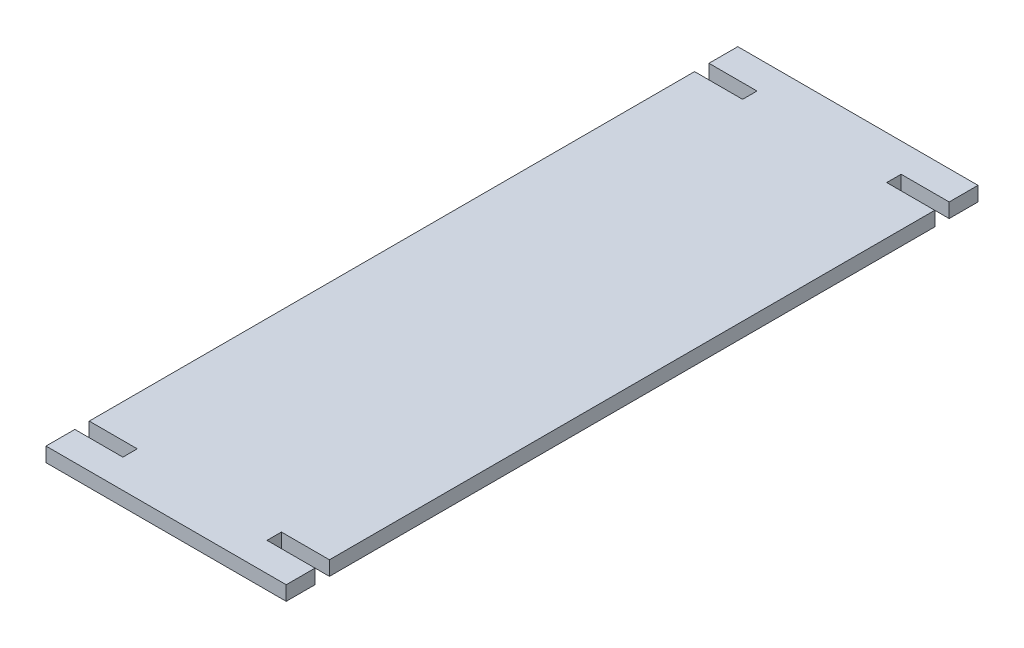
ISO-10303-21;
HEADER;
FILE_DESCRIPTION(('STEP AP214'),'2;1');
FILE_NAME('part.step','',(''),(''),'','','');
FILE_SCHEMA(('AUTOMOTIVE_DESIGN { 1 0 10303 214 1 1 1 1 }'));
ENDSEC;
DATA;
#1=APPLICATION_CONTEXT('core data for automotive mechanical design processes');
#2=APPLICATION_PROTOCOL_DEFINITION('international standard','automotive_design',2000,#1);
#3=PRODUCT_CONTEXT('',#1,'mechanical');
#4=PRODUCT('Part','Part','',(#3));
#5=PRODUCT_RELATED_PRODUCT_CATEGORY('part','',(#4));
#6=PRODUCT_DEFINITION_FORMATION('','',#4);
#7=PRODUCT_DEFINITION_CONTEXT('part definition',#1,'design');
#8=PRODUCT_DEFINITION('design','',#6,#7);
#9=PRODUCT_DEFINITION_SHAPE('','',#8);
#10=(LENGTH_UNIT() NAMED_UNIT(*) SI_UNIT(.MILLI.,.METRE.));
#11=(NAMED_UNIT(*) PLANE_ANGLE_UNIT() SI_UNIT($,.RADIAN.));
#12=(NAMED_UNIT(*) SI_UNIT($,.STERADIAN.) SOLID_ANGLE_UNIT());
#13=UNCERTAINTY_MEASURE_WITH_UNIT(LENGTH_MEASURE(1.E-05),#10,'distance_accuracy_value','');
#14=(GEOMETRIC_REPRESENTATION_CONTEXT(3) GLOBAL_UNCERTAINTY_ASSIGNED_CONTEXT((#13)) GLOBAL_UNIT_ASSIGNED_CONTEXT((#10,
#11,#12)) REPRESENTATION_CONTEXT('',''));
#15=CARTESIAN_POINT('',(0.,0.,0.));
#16=DIRECTION('',(0.,0.,1.));
#17=DIRECTION('',(1.,0.,0.));
#18=AXIS2_PLACEMENT_3D('',#15,#16,#17);
#19=CARTESIAN_POINT('',(0.,6.,0.));
#20=DIRECTION('',(-1.,0.,0.));
#21=DIRECTION('',(0.,0.,1.));
#22=AXIS2_PLACEMENT_3D('',#19,#20,#21);
#23=PLANE('',#22);
#24=DIRECTION('',(0.,0.,-1.));
#25=VECTOR('',#24,1.);
#26=CARTESIAN_POINT('',(0.,6.,0.));
#27=LINE('',#26,#25);
#28=CARTESIAN_POINT('',(0.,6.,-276.));
#29=VERTEX_POINT('',#28);
#30=CARTESIAN_POINT('',(0.,6.,-288.));
#31=VERTEX_POINT('',#30);
#32=EDGE_CURVE('E339',#29,#31,#27,.T.);
#33=ORIENTED_EDGE('',*,*,#32,.F.);
#34=DIRECTION('',(0.,1.,0.));
#35=VECTOR('',#34,1.);
#36=CARTESIAN_POINT('',(0.,0.,-276.));
#37=LINE('',#36,#35);
#38=CARTESIAN_POINT('',(0.,0.,-276.));
#39=VERTEX_POINT('',#38);
#40=EDGE_CURVE('E223',#39,#29,#37,.T.);
#41=ORIENTED_EDGE('',*,*,#40,.F.);
#42=DIRECTION('',(0.,0.,-1.));
#43=VECTOR('',#42,1.);
#44=CARTESIAN_POINT('',(0.,0.,0.));
#45=LINE('',#44,#43);
#46=CARTESIAN_POINT('',(0.,0.,-288.));
#47=VERTEX_POINT('',#46);
#48=EDGE_CURVE('E324',#39,#47,#45,.T.);
#49=ORIENTED_EDGE('',*,*,#48,.T.);
#50=DIRECTION('',(0.,-1.,0.));
#51=VECTOR('',#50,1.);
#52=CARTESIAN_POINT('',(0.,6.,-288.));
#53=LINE('',#52,#51);
#54=EDGE_CURVE('E11',#31,#47,#53,.T.);
#55=ORIENTED_EDGE('',*,*,#54,.F.);
#56=EDGE_LOOP('',(#33,#41,#49,#55));
#57=FACE_BOUND('',#56,.T.);
#58=ADVANCED_FACE('F45',(#57),#23,.F.);
#59=CARTESIAN_POINT('',(0.,0.,-18.));
#60=VERTEX_POINT('',#59);
#61=CARTESIAN_POINT('',(0.,0.,-270.));
#62=VERTEX_POINT('',#61);
#63=EDGE_CURVE('E357',#60,#62,#45,.T.);
#64=ORIENTED_EDGE('',*,*,#63,.T.);
#65=DIRECTION('',(0.,1.,0.));
#66=VECTOR('',#65,1.);
#67=CARTESIAN_POINT('',(0.,0.,-270.));
#68=LINE('',#67,#66);
#69=CARTESIAN_POINT('',(0.,6.,-270.));
#70=VERTEX_POINT('',#69);
#71=EDGE_CURVE('E69',#62,#70,#68,.T.);
#72=ORIENTED_EDGE('',*,*,#71,.T.);
#73=CARTESIAN_POINT('',(0.,6.,-18.));
#74=VERTEX_POINT('',#73);
#75=EDGE_CURVE('E338',#74,#70,#27,.T.);
#76=ORIENTED_EDGE('',*,*,#75,.F.);
#77=DIRECTION('',(0.,1.,0.));
#78=VECTOR('',#77,1.);
#79=CARTESIAN_POINT('',(0.,0.,-18.));
#80=LINE('',#79,#78);
#81=EDGE_CURVE('E288',#60,#74,#80,.T.);
#82=ORIENTED_EDGE('',*,*,#81,.F.);
#83=EDGE_LOOP('',(#64,#72,#76,#82));
#84=FACE_BOUND('',#83,.T.);
#85=ADVANCED_FACE('F402',(#84),#23,.F.);
#86=CARTESIAN_POINT('',(-100.,6.,0.));
#87=DIRECTION('',(1.,0.,0.));
#88=DIRECTION('',(0.,0.,-1.));
#89=AXIS2_PLACEMENT_3D('',#86,#87,#88);
#90=PLANE('',#89);
#91=DIRECTION('',(0.,0.,1.));
#92=VECTOR('',#91,1.);
#93=CARTESIAN_POINT('',(-100.,0.,0.));
#94=LINE('',#93,#92);
#95=CARTESIAN_POINT('',(-100.,0.,-270.));
#96=VERTEX_POINT('',#95);
#97=CARTESIAN_POINT('',(-100.,0.,-18.));
#98=VERTEX_POINT('',#97);
#99=EDGE_CURVE('E366',#96,#98,#94,.T.);
#100=ORIENTED_EDGE('',*,*,#99,.T.);
#101=DIRECTION('',(0.,1.,0.));
#102=VECTOR('',#101,1.);
#103=CARTESIAN_POINT('',(-100.,0.,-18.));
#104=LINE('',#103,#102);
#105=CARTESIAN_POINT('',(-100.,6.,-18.));
#106=VERTEX_POINT('',#105);
#107=EDGE_CURVE('E216',#98,#106,#104,.T.);
#108=ORIENTED_EDGE('',*,*,#107,.T.);
#109=DIRECTION('',(0.,0.,1.));
#110=VECTOR('',#109,1.);
#111=CARTESIAN_POINT('',(-100.,6.,0.));
#112=LINE('',#111,#110);
#113=CARTESIAN_POINT('',(-100.,6.,-270.));
#114=VERTEX_POINT('',#113);
#115=EDGE_CURVE('E348',#114,#106,#112,.T.);
#116=ORIENTED_EDGE('',*,*,#115,.F.);
#117=DIRECTION('',(0.,1.,0.));
#118=VECTOR('',#117,1.);
#119=CARTESIAN_POINT('',(-100.,0.,-270.));
#120=LINE('',#119,#118);
#121=EDGE_CURVE('E310',#96,#114,#120,.T.);
#122=ORIENTED_EDGE('',*,*,#121,.F.);
#123=EDGE_LOOP('',(#100,#108,#116,#122));
#124=FACE_BOUND('',#123,.T.);
#125=ADVANCED_FACE('F434',(#124),#90,.F.);
#126=CARTESIAN_POINT('',(-100.,0.,-288.));
#127=VERTEX_POINT('',#126);
#128=CARTESIAN_POINT('',(-100.,0.,-276.));
#129=VERTEX_POINT('',#128);
#130=EDGE_CURVE('E361',#127,#129,#94,.T.);
#131=ORIENTED_EDGE('',*,*,#130,.T.);
#132=DIRECTION('',(0.,1.,0.));
#133=VECTOR('',#132,1.);
#134=CARTESIAN_POINT('',(-100.,0.,-276.));
#135=LINE('',#134,#133);
#136=CARTESIAN_POINT('',(-100.,6.,-276.));
#137=VERTEX_POINT('',#136);
#138=EDGE_CURVE('E320',#129,#137,#135,.T.);
#139=ORIENTED_EDGE('',*,*,#138,.T.);
#140=CARTESIAN_POINT('',(-100.,6.,-288.));
#141=VERTEX_POINT('',#140);
#142=EDGE_CURVE('E343',#141,#137,#112,.T.);
#143=ORIENTED_EDGE('',*,*,#142,.F.);
#144=DIRECTION('',(0.,-1.,0.));
#145=VECTOR('',#144,1.);
#146=CARTESIAN_POINT('',(-100.,6.,-288.));
#147=LINE('',#146,#145);
#148=EDGE_CURVE('E54',#141,#127,#147,.T.);
#149=ORIENTED_EDGE('',*,*,#148,.T.);
#150=EDGE_LOOP('',(#131,#139,#143,#149));
#151=FACE_BOUND('',#150,.T.);
#152=ADVANCED_FACE('F381',(#151),#90,.F.);
#153=CARTESIAN_POINT('',(0.,0.,0.));
#154=VERTEX_POINT('',#153);
#155=CARTESIAN_POINT('',(0.,0.,-12.));
#156=VERTEX_POINT('',#155);
#157=EDGE_CURVE('E352',#154,#156,#45,.T.);
#158=ORIENTED_EDGE('',*,*,#157,.T.);
#159=DIRECTION('',(0.,1.,0.));
#160=VECTOR('',#159,1.);
#161=CARTESIAN_POINT('',(0.,0.,-12.));
#162=LINE('',#161,#160);
#163=CARTESIAN_POINT('',(0.,6.,-12.));
#164=VERTEX_POINT('',#163);
#165=EDGE_CURVE('E291',#156,#164,#162,.T.);
#166=ORIENTED_EDGE('',*,*,#165,.T.);
#167=CARTESIAN_POINT('',(0.,6.,0.));
#168=VERTEX_POINT('',#167);
#169=EDGE_CURVE('E333',#168,#164,#27,.T.);
#170=ORIENTED_EDGE('',*,*,#169,.F.);
#171=DIRECTION('',(0.,-1.,0.));
#172=VECTOR('',#171,1.);
#173=CARTESIAN_POINT('',(0.,6.,0.));
#174=LINE('',#173,#172);
#175=EDGE_CURVE('E351',#168,#154,#174,.T.);
#176=ORIENTED_EDGE('',*,*,#175,.T.);
#177=EDGE_LOOP('',(#158,#166,#170,#176));
#178=FACE_BOUND('',#177,.T.);
#179=ADVANCED_FACE('F47',(#178),#23,.F.);
#180=CARTESIAN_POINT('',(0.,6.,-288.));
#181=DIRECTION('',(0.,0.,1.));
#182=DIRECTION('',(1.,0.,0.));
#183=AXIS2_PLACEMENT_3D('',#180,#181,#182);
#184=PLANE('',#183);
#185=DIRECTION('',(-1.,0.,0.));
#186=VECTOR('',#185,1.);
#187=CARTESIAN_POINT('',(0.,0.,-288.));
#188=LINE('',#187,#186);
#189=EDGE_CURVE('E356',#47,#127,#188,.T.);
#190=ORIENTED_EDGE('',*,*,#189,.T.);
#191=ORIENTED_EDGE('',*,*,#148,.F.);
#192=DIRECTION('',(-1.,0.,0.));
#193=VECTOR('',#192,1.);
#194=CARTESIAN_POINT('',(0.,6.,-288.));
#195=LINE('',#194,#193);
#196=EDGE_CURVE('E337',#31,#141,#195,.T.);
#197=ORIENTED_EDGE('',*,*,#196,.F.);
#198=ORIENTED_EDGE('',*,*,#54,.T.);
#199=EDGE_LOOP('',(#190,#191,#197,#198));
#200=FACE_BOUND('',#199,.T.);
#201=ADVANCED_FACE('F395',(#200),#184,.F.);
#202=CARTESIAN_POINT('',(-100.,6.,-12.));
#203=VERTEX_POINT('',#202);
#204=CARTESIAN_POINT('',(-100.,6.,0.));
#205=VERTEX_POINT('',#204);
#206=EDGE_CURVE('E342',#203,#205,#112,.T.);
#207=ORIENTED_EDGE('',*,*,#206,.F.);
#208=DIRECTION('',(0.,1.,0.));
#209=VECTOR('',#208,1.);
#210=CARTESIAN_POINT('',(-100.,0.,-12.));
#211=LINE('',#210,#209);
#212=CARTESIAN_POINT('',(-100.,0.,-12.));
#213=VERTEX_POINT('',#212);
#214=EDGE_CURVE('E239',#213,#203,#211,.T.);
#215=ORIENTED_EDGE('',*,*,#214,.F.);
#216=CARTESIAN_POINT('',(-100.,0.,0.));
#217=VERTEX_POINT('',#216);
#218=EDGE_CURVE('E360',#213,#217,#94,.T.);
#219=ORIENTED_EDGE('',*,*,#218,.T.);
#220=DIRECTION('',(0.,-1.,0.));
#221=VECTOR('',#220,1.);
#222=CARTESIAN_POINT('',(-100.,6.,0.));
#223=LINE('',#222,#221);
#224=EDGE_CURVE('E372',#205,#217,#223,.T.);
#225=ORIENTED_EDGE('',*,*,#224,.F.);
#226=EDGE_LOOP('',(#207,#215,#219,#225));
#227=FACE_BOUND('',#226,.T.);
#228=ADVANCED_FACE('F447',(#227),#90,.F.);
#229=CARTESIAN_POINT('',(0.,6.,0.));
#230=DIRECTION('',(0.,0.,-1.));
#231=DIRECTION('',(-1.,0.,0.));
#232=AXIS2_PLACEMENT_3D('',#229,#230,#231);
#233=PLANE('',#232);
#234=DIRECTION('',(1.,0.,0.));
#235=VECTOR('',#234,1.);
#236=CARTESIAN_POINT('',(0.,0.,0.));
#237=LINE('',#236,#235);
#238=EDGE_CURVE('E365',#217,#154,#237,.T.);
#239=ORIENTED_EDGE('',*,*,#238,.T.);
#240=ORIENTED_EDGE('',*,*,#175,.F.);
#241=DIRECTION('',(1.,0.,0.));
#242=VECTOR('',#241,1.);
#243=CARTESIAN_POINT('',(0.,6.,0.));
#244=LINE('',#243,#242);
#245=EDGE_CURVE('E347',#205,#168,#244,.T.);
#246=ORIENTED_EDGE('',*,*,#245,.F.);
#247=ORIENTED_EDGE('',*,*,#224,.T.);
#248=EDGE_LOOP('',(#239,#240,#246,#247));
#249=FACE_BOUND('',#248,.T.);
#250=ADVANCED_FACE('F423',(#249),#233,.F.);
#251=CARTESIAN_POINT('',(0.,6.,0.));
#252=DIRECTION('',(0.,1.,0.));
#253=DIRECTION('',(0.,0.,1.));
#254=AXIS2_PLACEMENT_3D('',#251,#252,#253);
#255=PLANE('',#254);
#256=DIRECTION('',(-1.,0.,0.));
#257=VECTOR('',#256,1.);
#258=CARTESIAN_POINT('',(-20.,6.,-276.));
#259=LINE('',#258,#257);
#260=CARTESIAN_POINT('',(-20.,6.,-276.));
#261=VERTEX_POINT('',#260);
#262=EDGE_CURVE('E205',#29,#261,#259,.T.);
#263=ORIENTED_EDGE('',*,*,#262,.F.);
#264=ORIENTED_EDGE('',*,*,#32,.T.);
#265=ORIENTED_EDGE('',*,*,#196,.T.);
#266=ORIENTED_EDGE('',*,*,#142,.T.);
#267=DIRECTION('',(-1.,0.,0.));
#268=VECTOR('',#267,1.);
#269=CARTESIAN_POINT('',(-100.,6.,-276.));
#270=LINE('',#269,#268);
#271=CARTESIAN_POINT('',(-80.,6.,-276.));
#272=VERTEX_POINT('',#271);
#273=EDGE_CURVE('E302',#272,#137,#270,.T.);
#274=ORIENTED_EDGE('',*,*,#273,.F.);
#275=DIRECTION('',(0.,0.,-1.));
#276=VECTOR('',#275,1.);
#277=CARTESIAN_POINT('',(-80.,6.,-276.));
#278=LINE('',#277,#276);
#279=CARTESIAN_POINT('',(-80.,6.,-270.));
#280=VERTEX_POINT('',#279);
#281=EDGE_CURVE('E314',#280,#272,#278,.T.);
#282=ORIENTED_EDGE('',*,*,#281,.F.);
#283=DIRECTION('',(1.,0.,0.));
#284=VECTOR('',#283,1.);
#285=CARTESIAN_POINT('',(-100.,6.,-270.));
#286=LINE('',#285,#284);
#287=EDGE_CURVE('E222',#114,#280,#286,.T.);
#288=ORIENTED_EDGE('',*,*,#287,.F.);
#289=ORIENTED_EDGE('',*,*,#115,.T.);
#290=DIRECTION('',(-1.,0.,0.));
#291=VECTOR('',#290,1.);
#292=CARTESIAN_POINT('',(-100.,6.,-18.));
#293=LINE('',#292,#291);
#294=CARTESIAN_POINT('',(-80.,6.,-18.));
#295=VERTEX_POINT('',#294);
#296=EDGE_CURVE('E232',#295,#106,#293,.T.);
#297=ORIENTED_EDGE('',*,*,#296,.F.);
#298=DIRECTION('',(0.,0.,-1.));
#299=VECTOR('',#298,1.);
#300=CARTESIAN_POINT('',(-80.,6.,-18.));
#301=LINE('',#300,#299);
#302=CARTESIAN_POINT('',(-80.,6.,-12.));
#303=VERTEX_POINT('',#302);
#304=EDGE_CURVE('E244',#303,#295,#301,.T.);
#305=ORIENTED_EDGE('',*,*,#304,.F.);
#306=DIRECTION('',(1.,0.,0.));
#307=VECTOR('',#306,1.);
#308=CARTESIAN_POINT('',(-100.,6.,-12.));
#309=LINE('',#308,#307);
#310=EDGE_CURVE('E240',#203,#303,#309,.T.);
#311=ORIENTED_EDGE('',*,*,#310,.F.);
#312=ORIENTED_EDGE('',*,*,#206,.T.);
#313=ORIENTED_EDGE('',*,*,#245,.T.);
#314=ORIENTED_EDGE('',*,*,#169,.T.);
#315=DIRECTION('',(1.,0.,0.));
#316=VECTOR('',#315,1.);
#317=CARTESIAN_POINT('',(-20.,6.,-12.));
#318=LINE('',#317,#316);
#319=CARTESIAN_POINT('',(-20.,6.,-12.));
#320=VERTEX_POINT('',#319);
#321=EDGE_CURVE('E280',#320,#164,#318,.T.);
#322=ORIENTED_EDGE('',*,*,#321,.F.);
#323=DIRECTION('',(0.,0.,1.));
#324=VECTOR('',#323,1.);
#325=CARTESIAN_POINT('',(-20.,6.,-18.));
#326=LINE('',#325,#324);
#327=CARTESIAN_POINT('',(-20.,6.,-18.));
#328=VERTEX_POINT('',#327);
#329=EDGE_CURVE('E276',#328,#320,#326,.T.);
#330=ORIENTED_EDGE('',*,*,#329,.F.);
#331=DIRECTION('',(-1.,0.,0.));
#332=VECTOR('',#331,1.);
#333=CARTESIAN_POINT('',(-20.,6.,-18.));
#334=LINE('',#333,#332);
#335=EDGE_CURVE('E267',#74,#328,#334,.T.);
#336=ORIENTED_EDGE('',*,*,#335,.F.);
#337=ORIENTED_EDGE('',*,*,#75,.T.);
#338=DIRECTION('',(1.,0.,0.));
#339=VECTOR('',#338,1.);
#340=CARTESIAN_POINT('',(-20.,6.,-270.));
#341=LINE('',#340,#339);
#342=CARTESIAN_POINT('',(-20.,6.,-270.));
#343=VERTEX_POINT('',#342);
#344=EDGE_CURVE('E209',#343,#70,#341,.T.);
#345=ORIENTED_EDGE('',*,*,#344,.F.);
#346=DIRECTION('',(0.,0.,1.));
#347=VECTOR('',#346,1.);
#348=CARTESIAN_POINT('',(-20.,6.,-276.));
#349=LINE('',#348,#347);
#350=EDGE_CURVE('E190',#261,#343,#349,.T.);
#351=ORIENTED_EDGE('',*,*,#350,.F.);
#352=EDGE_LOOP('',(#263,#264,#265,#266,#274,#282,#288,#289,#297,#305,#311,#312,#313,#314,#322,
#330,#336,#337,#345,#351));
#353=FACE_BOUND('',#352,.T.);
#354=ADVANCED_FACE('F391',(#353),#255,.T.);
#355=CARTESIAN_POINT('',(0.,0.,0.));
#356=DIRECTION('',(0.,1.,0.));
#357=DIRECTION('',(0.,0.,1.));
#358=AXIS2_PLACEMENT_3D('',#355,#356,#357);
#359=PLANE('',#358);
#360=ORIENTED_EDGE('',*,*,#48,.F.);
#361=DIRECTION('',(-1.,0.,0.));
#362=VECTOR('',#361,1.);
#363=CARTESIAN_POINT('',(-20.,0.,-276.));
#364=LINE('',#363,#362);
#365=CARTESIAN_POINT('',(-20.,0.,-276.));
#366=VERTEX_POINT('',#365);
#367=EDGE_CURVE('E193',#39,#366,#364,.T.);
#368=ORIENTED_EDGE('',*,*,#367,.T.);
#369=DIRECTION('',(0.,0.,1.));
#370=VECTOR('',#369,1.);
#371=CARTESIAN_POINT('',(-20.,0.,-276.));
#372=LINE('',#371,#370);
#373=CARTESIAN_POINT('',(-20.,0.,-270.));
#374=VERTEX_POINT('',#373);
#375=EDGE_CURVE('E187',#366,#374,#372,.T.);
#376=ORIENTED_EDGE('',*,*,#375,.T.);
#377=DIRECTION('',(1.,0.,0.));
#378=VECTOR('',#377,1.);
#379=CARTESIAN_POINT('',(-20.,0.,-270.));
#380=LINE('',#379,#378);
#381=EDGE_CURVE('E195',#374,#62,#380,.T.);
#382=ORIENTED_EDGE('',*,*,#381,.T.);
#383=ORIENTED_EDGE('',*,*,#63,.F.);
#384=DIRECTION('',(-1.,0.,0.));
#385=VECTOR('',#384,1.);
#386=CARTESIAN_POINT('',(-20.,0.,-18.));
#387=LINE('',#386,#385);
#388=CARTESIAN_POINT('',(-20.,0.,-18.));
#389=VERTEX_POINT('',#388);
#390=EDGE_CURVE('E271',#60,#389,#387,.T.);
#391=ORIENTED_EDGE('',*,*,#390,.T.);
#392=DIRECTION('',(0.,0.,1.));
#393=VECTOR('',#392,1.);
#394=CARTESIAN_POINT('',(-20.,0.,-18.));
#395=LINE('',#394,#393);
#396=CARTESIAN_POINT('',(-20.,0.,-12.));
#397=VERTEX_POINT('',#396);
#398=EDGE_CURVE('E262',#389,#397,#395,.T.);
#399=ORIENTED_EDGE('',*,*,#398,.T.);
#400=DIRECTION('',(1.,0.,0.));
#401=VECTOR('',#400,1.);
#402=CARTESIAN_POINT('',(-20.,0.,-12.));
#403=LINE('',#402,#401);
#404=EDGE_CURVE('E266',#397,#156,#403,.T.);
#405=ORIENTED_EDGE('',*,*,#404,.T.);
#406=ORIENTED_EDGE('',*,*,#157,.F.);
#407=ORIENTED_EDGE('',*,*,#238,.F.);
#408=ORIENTED_EDGE('',*,*,#218,.F.);
#409=DIRECTION('',(1.,0.,0.));
#410=VECTOR('',#409,1.);
#411=CARTESIAN_POINT('',(-100.,0.,-12.));
#412=LINE('',#411,#410);
#413=CARTESIAN_POINT('',(-80.,0.,-12.));
#414=VERTEX_POINT('',#413);
#415=EDGE_CURVE('E228',#213,#414,#412,.T.);
#416=ORIENTED_EDGE('',*,*,#415,.T.);
#417=DIRECTION('',(0.,0.,-1.));
#418=VECTOR('',#417,1.);
#419=CARTESIAN_POINT('',(-80.,0.,-18.));
#420=LINE('',#419,#418);
#421=CARTESIAN_POINT('',(-80.,0.,-18.));
#422=VERTEX_POINT('',#421);
#423=EDGE_CURVE('E61',#414,#422,#420,.T.);
#424=ORIENTED_EDGE('',*,*,#423,.T.);
#425=DIRECTION('',(-1.,0.,0.));
#426=VECTOR('',#425,1.);
#427=CARTESIAN_POINT('',(-100.,0.,-18.));
#428=LINE('',#427,#426);
#429=EDGE_CURVE('E235',#422,#98,#428,.T.);
#430=ORIENTED_EDGE('',*,*,#429,.T.);
#431=ORIENTED_EDGE('',*,*,#99,.F.);
#432=DIRECTION('',(1.,0.,0.));
#433=VECTOR('',#432,1.);
#434=CARTESIAN_POINT('',(-100.,0.,-270.));
#435=LINE('',#434,#433);
#436=CARTESIAN_POINT('',(-80.,0.,-270.));
#437=VERTEX_POINT('',#436);
#438=EDGE_CURVE('E297',#96,#437,#435,.T.);
#439=ORIENTED_EDGE('',*,*,#438,.T.);
#440=DIRECTION('',(0.,0.,-1.));
#441=VECTOR('',#440,1.);
#442=CARTESIAN_POINT('',(-80.,0.,-276.));
#443=LINE('',#442,#441);
#444=CARTESIAN_POINT('',(-80.,0.,-276.));
#445=VERTEX_POINT('',#444);
#446=EDGE_CURVE('E301',#437,#445,#443,.T.);
#447=ORIENTED_EDGE('',*,*,#446,.T.);
#448=DIRECTION('',(-1.,0.,0.));
#449=VECTOR('',#448,1.);
#450=CARTESIAN_POINT('',(-100.,0.,-276.));
#451=LINE('',#450,#449);
#452=EDGE_CURVE('E306',#445,#129,#451,.T.);
#453=ORIENTED_EDGE('',*,*,#452,.T.);
#454=ORIENTED_EDGE('',*,*,#130,.F.);
#455=ORIENTED_EDGE('',*,*,#189,.F.);
#456=EDGE_LOOP('',(#360,#368,#376,#382,#383,#391,#399,#405,#406,#407,#408,#416,#424,#430,#431,
#439,#447,#453,#454,#455));
#457=FACE_BOUND('',#456,.T.);
#458=ADVANCED_FACE('F203',(#457),#359,.F.);
#459=CARTESIAN_POINT('',(-100.,0.,-276.));
#460=DIRECTION('',(0.,0.,-1.));
#461=DIRECTION('',(-1.,0.,0.));
#462=AXIS2_PLACEMENT_3D('',#459,#460,#461);
#463=PLANE('',#462);
#464=ORIENTED_EDGE('',*,*,#273,.T.);
#465=ORIENTED_EDGE('',*,*,#138,.F.);
#466=ORIENTED_EDGE('',*,*,#452,.F.);
#467=DIRECTION('',(0.,1.,0.));
#468=VECTOR('',#467,1.);
#469=CARTESIAN_POINT('',(-80.,0.,-276.));
#470=LINE('',#469,#468);
#471=EDGE_CURVE('E325',#445,#272,#470,.T.);
#472=ORIENTED_EDGE('',*,*,#471,.T.);
#473=EDGE_LOOP('',(#464,#465,#466,#472));
#474=FACE_BOUND('',#473,.T.);
#475=ADVANCED_FACE('F387',(#474),#463,.F.);
#476=CARTESIAN_POINT('',(-80.,0.,-276.));
#477=DIRECTION('',(1.,0.,0.));
#478=DIRECTION('',(0.,0.,-1.));
#479=AXIS2_PLACEMENT_3D('',#476,#477,#478);
#480=PLANE('',#479);
#481=ORIENTED_EDGE('',*,*,#281,.T.);
#482=ORIENTED_EDGE('',*,*,#471,.F.);
#483=ORIENTED_EDGE('',*,*,#446,.F.);
#484=DIRECTION('',(0.,1.,0.));
#485=VECTOR('',#484,1.);
#486=CARTESIAN_POINT('',(-80.,0.,-270.));
#487=LINE('',#486,#485);
#488=EDGE_CURVE('E328',#437,#280,#487,.T.);
#489=ORIENTED_EDGE('',*,*,#488,.T.);
#490=EDGE_LOOP('',(#481,#482,#483,#489));
#491=FACE_BOUND('',#490,.T.);
#492=ADVANCED_FACE('F497',(#491),#480,.F.);
#493=CARTESIAN_POINT('',(-100.,0.,-270.));
#494=DIRECTION('',(0.,0.,1.));
#495=DIRECTION('',(1.,0.,0.));
#496=AXIS2_PLACEMENT_3D('',#493,#494,#495);
#497=PLANE('',#496);
#498=ORIENTED_EDGE('',*,*,#287,.T.);
#499=ORIENTED_EDGE('',*,*,#488,.F.);
#500=ORIENTED_EDGE('',*,*,#438,.F.);
#501=ORIENTED_EDGE('',*,*,#121,.T.);
#502=EDGE_LOOP('',(#498,#499,#500,#501));
#503=FACE_BOUND('',#502,.T.);
#504=ADVANCED_FACE('F507',(#503),#497,.F.);
#505=CARTESIAN_POINT('',(-20.,0.,-18.));
#506=DIRECTION('',(-1.,0.,0.));
#507=DIRECTION('',(0.,0.,1.));
#508=AXIS2_PLACEMENT_3D('',#505,#506,#507);
#509=PLANE('',#508);
#510=ORIENTED_EDGE('',*,*,#329,.T.);
#511=DIRECTION('',(0.,1.,0.));
#512=VECTOR('',#511,1.);
#513=CARTESIAN_POINT('',(-20.,0.,-12.));
#514=LINE('',#513,#512);
#515=EDGE_CURVE('E275',#397,#320,#514,.T.);
#516=ORIENTED_EDGE('',*,*,#515,.F.);
#517=ORIENTED_EDGE('',*,*,#398,.F.);
#518=DIRECTION('',(0.,1.,0.));
#519=VECTOR('',#518,1.);
#520=CARTESIAN_POINT('',(-20.,0.,-18.));
#521=LINE('',#520,#519);
#522=EDGE_CURVE('E245',#389,#328,#521,.T.);
#523=ORIENTED_EDGE('',*,*,#522,.T.);
#524=EDGE_LOOP('',(#510,#516,#517,#523));
#525=FACE_BOUND('',#524,.T.);
#526=ADVANCED_FACE('F411',(#525),#509,.F.);
#527=CARTESIAN_POINT('',(-20.,0.,-18.));
#528=DIRECTION('',(0.,0.,-1.));
#529=DIRECTION('',(-1.,0.,0.));
#530=AXIS2_PLACEMENT_3D('',#527,#528,#529);
#531=PLANE('',#530);
#532=ORIENTED_EDGE('',*,*,#335,.T.);
#533=ORIENTED_EDGE('',*,*,#522,.F.);
#534=ORIENTED_EDGE('',*,*,#390,.F.);
#535=ORIENTED_EDGE('',*,*,#81,.T.);
#536=EDGE_LOOP('',(#532,#533,#534,#535));
#537=FACE_BOUND('',#536,.T.);
#538=ADVANCED_FACE('F407',(#537),#531,.F.);
#539=CARTESIAN_POINT('',(-20.,0.,-12.));
#540=DIRECTION('',(0.,0.,1.));
#541=DIRECTION('',(1.,0.,0.));
#542=AXIS2_PLACEMENT_3D('',#539,#540,#541);
#543=PLANE('',#542);
#544=ORIENTED_EDGE('',*,*,#321,.T.);
#545=ORIENTED_EDGE('',*,*,#165,.F.);
#546=ORIENTED_EDGE('',*,*,#404,.F.);
#547=ORIENTED_EDGE('',*,*,#515,.T.);
#548=EDGE_LOOP('',(#544,#545,#546,#547));
#549=FACE_BOUND('',#548,.T.);
#550=ADVANCED_FACE('F415',(#549),#543,.F.);
#551=CARTESIAN_POINT('',(-100.,0.,-18.));
#552=DIRECTION('',(0.,0.,-1.));
#553=DIRECTION('',(-1.,0.,0.));
#554=AXIS2_PLACEMENT_3D('',#551,#552,#553);
#555=PLANE('',#554);
#556=ORIENTED_EDGE('',*,*,#296,.T.);
#557=ORIENTED_EDGE('',*,*,#107,.F.);
#558=ORIENTED_EDGE('',*,*,#429,.F.);
#559=DIRECTION('',(0.,1.,0.));
#560=VECTOR('',#559,1.);
#561=CARTESIAN_POINT('',(-80.,0.,-18.));
#562=LINE('',#561,#560);
#563=EDGE_CURVE('E254',#422,#295,#562,.T.);
#564=ORIENTED_EDGE('',*,*,#563,.T.);
#565=EDGE_LOOP('',(#556,#557,#558,#564));
#566=FACE_BOUND('',#565,.T.);
#567=ADVANCED_FACE('F439',(#566),#555,.F.);
#568=CARTESIAN_POINT('',(-80.,0.,-18.));
#569=DIRECTION('',(1.,0.,0.));
#570=DIRECTION('',(0.,0.,-1.));
#571=AXIS2_PLACEMENT_3D('',#568,#569,#570);
#572=PLANE('',#571);
#573=ORIENTED_EDGE('',*,*,#304,.T.);
#574=ORIENTED_EDGE('',*,*,#563,.F.);
#575=ORIENTED_EDGE('',*,*,#423,.F.);
#576=DIRECTION('',(0.,1.,0.));
#577=VECTOR('',#576,1.);
#578=CARTESIAN_POINT('',(-80.,0.,-12.));
#579=LINE('',#578,#577);
#580=EDGE_CURVE('E257',#414,#303,#579,.T.);
#581=ORIENTED_EDGE('',*,*,#580,.T.);
#582=EDGE_LOOP('',(#573,#574,#575,#581));
#583=FACE_BOUND('',#582,.T.);
#584=ADVANCED_FACE('F576',(#583),#572,.F.);
#585=CARTESIAN_POINT('',(-100.,0.,-12.));
#586=DIRECTION('',(0.,0.,1.));
#587=DIRECTION('',(1.,0.,0.));
#588=AXIS2_PLACEMENT_3D('',#585,#586,#587);
#589=PLANE('',#588);
#590=ORIENTED_EDGE('',*,*,#310,.T.);
#591=ORIENTED_EDGE('',*,*,#580,.F.);
#592=ORIENTED_EDGE('',*,*,#415,.F.);
#593=ORIENTED_EDGE('',*,*,#214,.T.);
#594=EDGE_LOOP('',(#590,#591,#592,#593));
#595=FACE_BOUND('',#594,.T.);
#596=ADVANCED_FACE('F585',(#595),#589,.F.);
#597=CARTESIAN_POINT('',(-20.,0.,-276.));
#598=DIRECTION('',(-1.,0.,0.));
#599=DIRECTION('',(0.,0.,1.));
#600=AXIS2_PLACEMENT_3D('',#597,#598,#599);
#601=PLANE('',#600);
#602=ORIENTED_EDGE('',*,*,#350,.T.);
#603=DIRECTION('',(0.,1.,0.));
#604=VECTOR('',#603,1.);
#605=CARTESIAN_POINT('',(-20.,0.,-270.));
#606=LINE('',#605,#604);
#607=EDGE_CURVE('E184',#374,#343,#606,.T.);
#608=ORIENTED_EDGE('',*,*,#607,.F.);
#609=ORIENTED_EDGE('',*,*,#375,.F.);
#610=DIRECTION('',(0.,1.,0.));
#611=VECTOR('',#610,1.);
#612=CARTESIAN_POINT('',(-20.,0.,-276.));
#613=LINE('',#612,#611);
#614=EDGE_CURVE('E219',#366,#261,#613,.T.);
#615=ORIENTED_EDGE('',*,*,#614,.T.);
#616=EDGE_LOOP('',(#602,#608,#609,#615));
#617=FACE_BOUND('',#616,.T.);
#618=ADVANCED_FACE('F185',(#617),#601,.F.);
#619=CARTESIAN_POINT('',(-20.,0.,-276.));
#620=DIRECTION('',(0.,0.,-1.));
#621=DIRECTION('',(-1.,0.,0.));
#622=AXIS2_PLACEMENT_3D('',#619,#620,#621);
#623=PLANE('',#622);
#624=ORIENTED_EDGE('',*,*,#262,.T.);
#625=ORIENTED_EDGE('',*,*,#614,.F.);
#626=ORIENTED_EDGE('',*,*,#367,.F.);
#627=ORIENTED_EDGE('',*,*,#40,.T.);
#628=EDGE_LOOP('',(#624,#625,#626,#627));
#629=FACE_BOUND('',#628,.T.);
#630=ADVANCED_FACE('F603',(#629),#623,.F.);
#631=CARTESIAN_POINT('',(-20.,0.,-270.));
#632=DIRECTION('',(0.,0.,1.));
#633=DIRECTION('',(1.,0.,0.));
#634=AXIS2_PLACEMENT_3D('',#631,#632,#633);
#635=PLANE('',#634);
#636=ORIENTED_EDGE('',*,*,#344,.T.);
#637=ORIENTED_EDGE('',*,*,#71,.F.);
#638=ORIENTED_EDGE('',*,*,#381,.F.);
#639=ORIENTED_EDGE('',*,*,#607,.T.);
#640=EDGE_LOOP('',(#636,#637,#638,#639));
#641=FACE_BOUND('',#640,.T.);
#642=ADVANCED_FACE('F196',(#641),#635,.F.);
#643=CLOSED_SHELL('',(#58,#85,#125,#152,#179,#201,#228,#250,#354,#458,#475,#492,#504,#526,#538,
#550,#567,#584,#596,#618,#630,#642));
#644=MANIFOLD_SOLID_BREP('B2',#643);
#645=ADVANCED_BREP_SHAPE_REPRESENTATION('',(#18,#644),#14);
#646=SHAPE_DEFINITION_REPRESENTATION(#9,#645);
ENDSEC;
END-ISO-10303-21;
